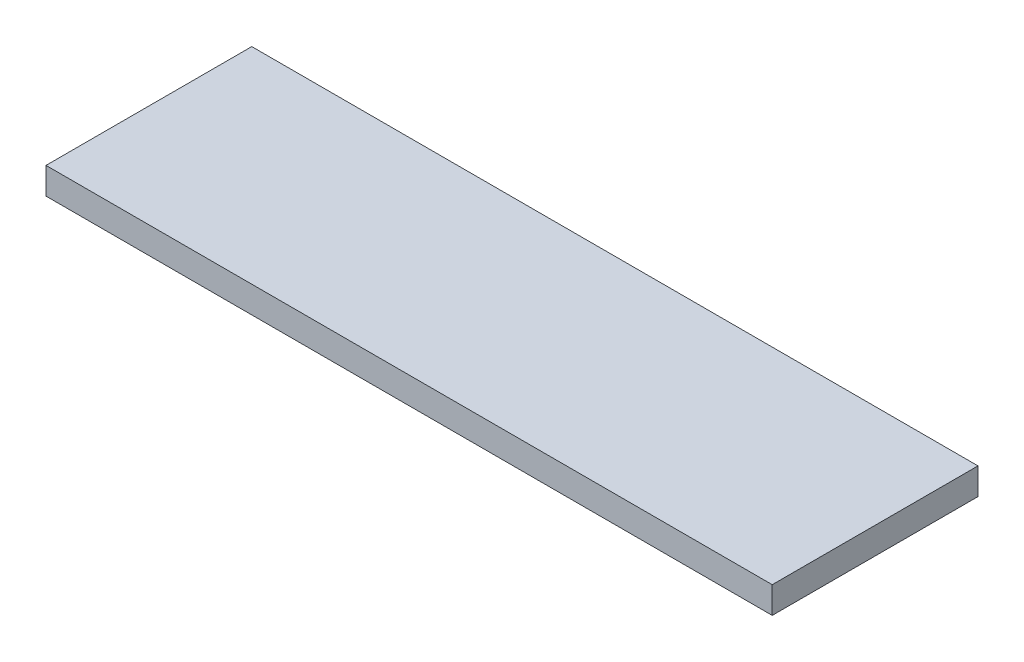
ISO-10303-21;
HEADER;
FILE_DESCRIPTION(('STEP AP214'),'2;1');
FILE_NAME('part.step','',(''),(''),'','','');
FILE_SCHEMA(('AUTOMOTIVE_DESIGN { 1 0 10303 214 1 1 1 1 }'));
ENDSEC;
DATA;
#1=APPLICATION_CONTEXT('core data for automotive mechanical design processes');
#2=APPLICATION_PROTOCOL_DEFINITION('international standard','automotive_design',2000,#1);
#3=PRODUCT_CONTEXT('',#1,'mechanical');
#4=PRODUCT('Part','Part','',(#3));
#5=PRODUCT_RELATED_PRODUCT_CATEGORY('part','',(#4));
#6=PRODUCT_DEFINITION_FORMATION('','',#4);
#7=PRODUCT_DEFINITION_CONTEXT('part definition',#1,'design');
#8=PRODUCT_DEFINITION('design','',#6,#7);
#9=PRODUCT_DEFINITION_SHAPE('','',#8);
#10=(LENGTH_UNIT() NAMED_UNIT(*) SI_UNIT(.MILLI.,.METRE.));
#11=(NAMED_UNIT(*) PLANE_ANGLE_UNIT() SI_UNIT($,.RADIAN.));
#12=(NAMED_UNIT(*) SI_UNIT($,.STERADIAN.) SOLID_ANGLE_UNIT());
#13=UNCERTAINTY_MEASURE_WITH_UNIT(LENGTH_MEASURE(1.E-05),#10,'distance_accuracy_value','');
#14=(GEOMETRIC_REPRESENTATION_CONTEXT(3) GLOBAL_UNCERTAINTY_ASSIGNED_CONTEXT((#13)) GLOBAL_UNIT_ASSIGNED_CONTEXT((#10,
#11,#12)) REPRESENTATION_CONTEXT('',''));
#15=CARTESIAN_POINT('',(0.,0.,0.));
#16=DIRECTION('',(0.,0.,1.));
#17=DIRECTION('',(1.,0.,0.));
#18=AXIS2_PLACEMENT_3D('',#15,#16,#17);
#19=CARTESIAN_POINT('',(-246.898336628427,22.,-113.954400700812));
#20=DIRECTION('',(0.,0.,1.));
#21=DIRECTION('',(1.,0.,0.));
#22=AXIS2_PLACEMENT_3D('',#19,#20,#21);
#23=PLANE('',#22);
#24=DIRECTION('',(-1.,0.,0.));
#25=VECTOR('',#24,1.);
#26=CARTESIAN_POINT('',(-246.898336628427,0.,-113.954400700812));
#27=LINE('',#26,#25);
#28=CARTESIAN_POINT('',(353.101663371573,0.,-113.954400700812));
#29=VERTEX_POINT('',#28);
#30=CARTESIAN_POINT('',(-246.898336628427,0.,-113.954400700812));
#31=VERTEX_POINT('',#30);
#32=EDGE_CURVE('E107',#29,#31,#27,.T.);
#33=ORIENTED_EDGE('',*,*,#32,.T.);
#34=DIRECTION('',(0.,-1.,0.));
#35=VECTOR('',#34,1.);
#36=CARTESIAN_POINT('',(-246.898336628427,22.,-113.954400700812));
#37=LINE('',#36,#35);
#38=CARTESIAN_POINT('',(-246.898336628427,22.,-113.954400700812));
#39=VERTEX_POINT('',#38);
#40=EDGE_CURVE('E11',#39,#31,#37,.T.);
#41=ORIENTED_EDGE('',*,*,#40,.F.);
#42=DIRECTION('',(-1.,0.,0.));
#43=VECTOR('',#42,1.);
#44=CARTESIAN_POINT('',(-246.898336628427,22.,-113.954400700812));
#45=LINE('',#44,#43);
#46=CARTESIAN_POINT('',(353.101663371573,22.,-113.954400700812));
#47=VERTEX_POINT('',#46);
#48=EDGE_CURVE('E90',#47,#39,#45,.T.);
#49=ORIENTED_EDGE('',*,*,#48,.F.);
#50=DIRECTION('',(0.,-1.,0.));
#51=VECTOR('',#50,1.);
#52=CARTESIAN_POINT('',(353.101663371573,22.,-113.954400700812));
#53=LINE('',#52,#51);
#54=EDGE_CURVE('E103',#47,#29,#53,.T.);
#55=ORIENTED_EDGE('',*,*,#54,.T.);
#56=EDGE_LOOP('',(#33,#41,#49,#55));
#57=FACE_BOUND('',#56,.T.);
#58=ADVANCED_FACE('F38',(#57),#23,.F.);
#59=CARTESIAN_POINT('',(-246.898336628427,22.,56.0455992991882));
#60=DIRECTION('',(1.,0.,0.));
#61=DIRECTION('',(0.,0.,-1.));
#62=AXIS2_PLACEMENT_3D('',#59,#60,#61);
#63=PLANE('',#62);
#64=DIRECTION('',(0.,0.,1.));
#65=VECTOR('',#64,1.);
#66=CARTESIAN_POINT('',(-246.898336628427,0.,56.0455992991882));
#67=LINE('',#66,#65);
#68=CARTESIAN_POINT('',(-246.898336628427,0.,56.0455992991882));
#69=VERTEX_POINT('',#68);
#70=EDGE_CURVE('E95',#31,#69,#67,.T.);
#71=ORIENTED_EDGE('',*,*,#70,.T.);
#72=DIRECTION('',(0.,-1.,0.));
#73=VECTOR('',#72,1.);
#74=CARTESIAN_POINT('',(-246.898336628427,22.,56.0455992991882));
#75=LINE('',#74,#73);
#76=CARTESIAN_POINT('',(-246.898336628427,22.,56.0455992991882));
#77=VERTEX_POINT('',#76);
#78=EDGE_CURVE('E47',#77,#69,#75,.T.);
#79=ORIENTED_EDGE('',*,*,#78,.F.);
#80=DIRECTION('',(0.,0.,1.));
#81=VECTOR('',#80,1.);
#82=CARTESIAN_POINT('',(-246.898336628427,22.,56.0455992991882));
#83=LINE('',#82,#81);
#84=EDGE_CURVE('E85',#39,#77,#83,.T.);
#85=ORIENTED_EDGE('',*,*,#84,.F.);
#86=ORIENTED_EDGE('',*,*,#40,.T.);
#87=EDGE_LOOP('',(#71,#79,#85,#86));
#88=FACE_BOUND('',#87,.T.);
#89=ADVANCED_FACE('F94',(#88),#63,.F.);
#90=CARTESIAN_POINT('',(353.101663371573,22.,56.0455992991881));
#91=DIRECTION('',(0.,0.,-1.));
#92=DIRECTION('',(-1.,0.,0.));
#93=AXIS2_PLACEMENT_3D('',#90,#91,#92);
#94=PLANE('',#93);
#95=DIRECTION('',(1.,0.,0.));
#96=VECTOR('',#95,1.);
#97=CARTESIAN_POINT('',(353.101663371573,0.,56.0455992991881));
#98=LINE('',#97,#96);
#99=CARTESIAN_POINT('',(353.101663371573,0.,56.0455992991881));
#100=VERTEX_POINT('',#99);
#101=EDGE_CURVE('E72',#69,#100,#98,.T.);
#102=ORIENTED_EDGE('',*,*,#101,.T.);
#103=DIRECTION('',(0.,-1.,0.));
#104=VECTOR('',#103,1.);
#105=CARTESIAN_POINT('',(353.101663371573,22.,56.0455992991881));
#106=LINE('',#105,#104);
#107=CARTESIAN_POINT('',(353.101663371573,22.,56.0455992991881));
#108=VERTEX_POINT('',#107);
#109=EDGE_CURVE('E97',#108,#100,#106,.T.);
#110=ORIENTED_EDGE('',*,*,#109,.F.);
#111=DIRECTION('',(1.,0.,0.));
#112=VECTOR('',#111,1.);
#113=CARTESIAN_POINT('',(353.101663371573,22.,56.0455992991881));
#114=LINE('',#113,#112);
#115=EDGE_CURVE('E88',#77,#108,#114,.T.);
#116=ORIENTED_EDGE('',*,*,#115,.F.);
#117=ORIENTED_EDGE('',*,*,#78,.T.);
#118=EDGE_LOOP('',(#102,#110,#116,#117));
#119=FACE_BOUND('',#118,.T.);
#120=ADVANCED_FACE('F98',(#119),#94,.F.);
#121=CARTESIAN_POINT('',(353.101663371573,22.,-113.954400700812));
#122=DIRECTION('',(-1.,0.,0.));
#123=DIRECTION('',(0.,0.,1.));
#124=AXIS2_PLACEMENT_3D('',#121,#122,#123);
#125=PLANE('',#124);
#126=DIRECTION('',(0.,0.,-1.));
#127=VECTOR('',#126,1.);
#128=CARTESIAN_POINT('',(353.101663371573,0.,-113.954400700812));
#129=LINE('',#128,#127);
#130=EDGE_CURVE('E78',#100,#29,#129,.T.);
#131=ORIENTED_EDGE('',*,*,#130,.T.);
#132=ORIENTED_EDGE('',*,*,#54,.F.);
#133=DIRECTION('',(0.,0.,-1.));
#134=VECTOR('',#133,1.);
#135=CARTESIAN_POINT('',(353.101663371573,22.,-113.954400700812));
#136=LINE('',#135,#134);
#137=EDGE_CURVE('E55',#108,#47,#136,.T.);
#138=ORIENTED_EDGE('',*,*,#137,.F.);
#139=ORIENTED_EDGE('',*,*,#109,.T.);
#140=EDGE_LOOP('',(#131,#132,#138,#139));
#141=FACE_BOUND('',#140,.T.);
#142=ADVANCED_FACE('F121',(#141),#125,.F.);
#143=CARTESIAN_POINT('',(0.,22.,0.));
#144=DIRECTION('',(0.,-1.,0.));
#145=DIRECTION('',(0.,0.,-1.));
#146=AXIS2_PLACEMENT_3D('',#143,#144,#145);
#147=PLANE('',#146);
#148=ORIENTED_EDGE('',*,*,#48,.T.);
#149=ORIENTED_EDGE('',*,*,#84,.T.);
#150=ORIENTED_EDGE('',*,*,#115,.T.);
#151=ORIENTED_EDGE('',*,*,#137,.T.);
#152=EDGE_LOOP('',(#148,#149,#150,#151));
#153=FACE_BOUND('',#152,.T.);
#154=ADVANCED_FACE('F86',(#153),#147,.F.);
#155=CARTESIAN_POINT('',(0.,0.,0.));
#156=DIRECTION('',(0.,-1.,0.));
#157=DIRECTION('',(0.,0.,-1.));
#158=AXIS2_PLACEMENT_3D('',#155,#156,#157);
#159=PLANE('',#158);
#160=ORIENTED_EDGE('',*,*,#32,.F.);
#161=ORIENTED_EDGE('',*,*,#130,.F.);
#162=ORIENTED_EDGE('',*,*,#101,.F.);
#163=ORIENTED_EDGE('',*,*,#70,.F.);
#164=EDGE_LOOP('',(#160,#161,#162,#163));
#165=FACE_BOUND('',#164,.T.);
#166=ADVANCED_FACE('F124',(#165),#159,.T.);
#167=CLOSED_SHELL('',(#58,#89,#120,#142,#154,#166));
#168=MANIFOLD_SOLID_BREP('B2',#167);
#169=ADVANCED_BREP_SHAPE_REPRESENTATION('',(#18,#168),#14);
#170=SHAPE_DEFINITION_REPRESENTATION(#9,#169);
ENDSEC;
END-ISO-10303-21;
